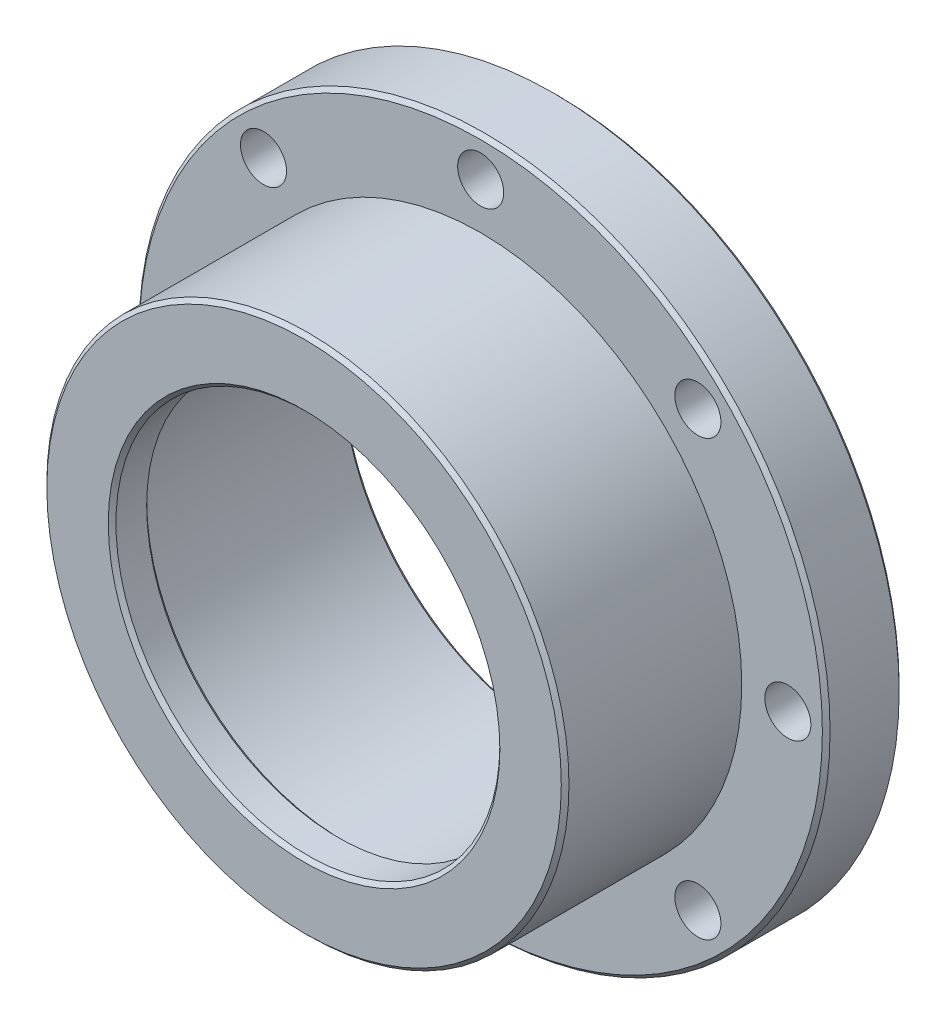
ISO-10303-21;
HEADER;
FILE_DESCRIPTION(('STEP AP214'),'2;1');
FILE_NAME('part.step','',(''),(''),'','','');
FILE_SCHEMA(('AUTOMOTIVE_DESIGN { 1 0 10303 214 1 1 1 1 }'));
ENDSEC;
DATA;
#1=APPLICATION_CONTEXT('core data for automotive mechanical design processes');
#2=APPLICATION_PROTOCOL_DEFINITION('international standard','automotive_design',2000,#1);
#3=PRODUCT_CONTEXT('',#1,'mechanical');
#4=PRODUCT('Part','Part','',(#3));
#5=PRODUCT_RELATED_PRODUCT_CATEGORY('part','',(#4));
#6=PRODUCT_DEFINITION_FORMATION('','',#4);
#7=PRODUCT_DEFINITION_CONTEXT('part definition',#1,'design');
#8=PRODUCT_DEFINITION('design','',#6,#7);
#9=PRODUCT_DEFINITION_SHAPE('','',#8);
#10=(LENGTH_UNIT() NAMED_UNIT(*) SI_UNIT(.MILLI.,.METRE.));
#11=(NAMED_UNIT(*) PLANE_ANGLE_UNIT() SI_UNIT($,.RADIAN.));
#12=(NAMED_UNIT(*) SI_UNIT($,.STERADIAN.) SOLID_ANGLE_UNIT());
#13=UNCERTAINTY_MEASURE_WITH_UNIT(LENGTH_MEASURE(1.E-05),#10,'distance_accuracy_value','');
#14=(GEOMETRIC_REPRESENTATION_CONTEXT(3) GLOBAL_UNCERTAINTY_ASSIGNED_CONTEXT((#13)) GLOBAL_UNIT_ASSIGNED_CONTEXT((#10,
#11,#12)) REPRESENTATION_CONTEXT('',''));
#15=CARTESIAN_POINT('',(0.,0.,0.));
#16=DIRECTION('',(0.,0.,1.));
#17=DIRECTION('',(1.,0.,0.));
#18=AXIS2_PLACEMENT_3D('',#15,#16,#17);
#19=CARTESIAN_POINT('',(0.,0.,-37.));
#20=DIRECTION('',(0.,0.,1.));
#21=DIRECTION('',(1.,0.,0.));
#22=AXIS2_PLACEMENT_3D('',#19,#20,#21);
#23=CYLINDRICAL_SURFACE('',#22,25.);
#24=CARTESIAN_POINT('',(0.,0.,28.5));
#25=DIRECTION('',(0.,0.,-1.));
#26=DIRECTION('',(-1.,0.,0.));
#27=AXIS2_PLACEMENT_3D('',#24,#25,#26);
#28=CIRCLE('',#27,25.);
#29=CARTESIAN_POINT('',(-25.,0.,28.5));
#30=VERTEX_POINT('',#29);
#31=EDGE_CURVE('E65',#30,#30,#28,.T.);
#32=ORIENTED_EDGE('',*,*,#31,.T.);
#33=EDGE_LOOP('',(#32));
#34=FACE_BOUND('',#33,.T.);
#35=CARTESIAN_POINT('',(0.,0.,32.5));
#36=DIRECTION('',(0.,0.,1.));
#37=DIRECTION('',(1.,0.,0.));
#38=AXIS2_PLACEMENT_3D('',#35,#36,#37);
#39=CIRCLE('',#38,25.);
#40=CARTESIAN_POINT('',(25.,0.,32.5));
#41=VERTEX_POINT('',#40);
#42=EDGE_CURVE('E68',#41,#41,#39,.T.);
#43=ORIENTED_EDGE('',*,*,#42,.T.);
#44=EDGE_LOOP('',(#43));
#45=FACE_BOUND('',#44,.T.);
#46=ADVANCED_FACE('F30',(#34,#45),#23,.F.);
#47=CARTESIAN_POINT('',(0.,0.,10.));
#48=DIRECTION('',(0.,0.,1.));
#49=DIRECTION('',(1.,0.,0.));
#50=AXIS2_PLACEMENT_3D('',#47,#48,#49);
#51=PLANE('',#50);
#52=CARTESIAN_POINT('',(0.,0.,10.));
#53=DIRECTION('',(0.,0.,1.));
#54=DIRECTION('',(1.,0.,0.));
#55=AXIS2_PLACEMENT_3D('',#52,#53,#54);
#56=CIRCLE('',#55,44.5);
#57=CARTESIAN_POINT('',(44.5,0.,10.));
#58=VERTEX_POINT('',#57);
#59=EDGE_CURVE('E45',#58,#58,#56,.T.);
#60=ORIENTED_EDGE('',*,*,#59,.T.);
#61=EDGE_LOOP('',(#60));
#62=FACE_BOUND('',#61,.T.);
#63=CARTESIAN_POINT('',(-28.2842712474619,28.2842712474619,10.));
#64=DIRECTION('',(0.,0.,1.));
#65=DIRECTION('',(1.,0.,0.));
#66=AXIS2_PLACEMENT_3D('',#63,#64,#65);
#67=CIRCLE('',#66,3.);
#68=CARTESIAN_POINT('',(-25.2842712474619,28.2842712474619,10.));
#69=VERTEX_POINT('',#68);
#70=EDGE_CURVE('E79',#69,#69,#67,.T.);
#71=ORIENTED_EDGE('',*,*,#70,.F.);
#72=EDGE_LOOP('',(#71));
#73=FACE_BOUND('',#72,.T.);
#74=CARTESIAN_POINT('',(-40.,0.,10.));
#75=DIRECTION('',(0.,0.,1.));
#76=DIRECTION('',(1.,0.,0.));
#77=AXIS2_PLACEMENT_3D('',#74,#75,#76);
#78=CIRCLE('',#77,3.);
#79=CARTESIAN_POINT('',(-37.,0.,10.));
#80=VERTEX_POINT('',#79);
#81=EDGE_CURVE('E78',#80,#80,#78,.T.);
#82=ORIENTED_EDGE('',*,*,#81,.F.);
#83=EDGE_LOOP('',(#82));
#84=FACE_BOUND('',#83,.T.);
#85=CARTESIAN_POINT('',(-28.2842712474619,-28.2842712474619,10.));
#86=DIRECTION('',(0.,0.,1.));
#87=DIRECTION('',(1.,0.,0.));
#88=AXIS2_PLACEMENT_3D('',#85,#86,#87);
#89=CIRCLE('',#88,3.);
#90=CARTESIAN_POINT('',(-25.2842712474619,-28.2842712474619,10.));
#91=VERTEX_POINT('',#90);
#92=EDGE_CURVE('E83',#91,#91,#89,.T.);
#93=ORIENTED_EDGE('',*,*,#92,.F.);
#94=EDGE_LOOP('',(#93));
#95=FACE_BOUND('',#94,.T.);
#96=CARTESIAN_POINT('',(0.,40.,10.));
#97=DIRECTION('',(0.,0.,1.));
#98=DIRECTION('',(1.,0.,0.));
#99=AXIS2_PLACEMENT_3D('',#96,#97,#98);
#100=CIRCLE('',#99,3.);
#101=CARTESIAN_POINT('',(3.,40.,10.));
#102=VERTEX_POINT('',#101);
#103=EDGE_CURVE('E87',#102,#102,#100,.T.);
#104=ORIENTED_EDGE('',*,*,#103,.F.);
#105=EDGE_LOOP('',(#104));
#106=FACE_BOUND('',#105,.T.);
#107=CARTESIAN_POINT('',(0.,-40.,10.));
#108=DIRECTION('',(0.,0.,1.));
#109=DIRECTION('',(1.,0.,0.));
#110=AXIS2_PLACEMENT_3D('',#107,#108,#109);
#111=CIRCLE('',#110,3.);
#112=CARTESIAN_POINT('',(3.00000000000001,-40.,10.));
#113=VERTEX_POINT('',#112);
#114=EDGE_CURVE('E91',#113,#113,#111,.T.);
#115=ORIENTED_EDGE('',*,*,#114,.F.);
#116=EDGE_LOOP('',(#115));
#117=FACE_BOUND('',#116,.T.);
#118=CARTESIAN_POINT('',(28.2842712474619,-28.2842712474619,10.));
#119=DIRECTION('',(0.,0.,1.));
#120=DIRECTION('',(1.,0.,0.));
#121=AXIS2_PLACEMENT_3D('',#118,#119,#120);
#122=CIRCLE('',#121,3.);
#123=CARTESIAN_POINT('',(31.2842712474619,-28.2842712474619,10.));
#124=VERTEX_POINT('',#123);
#125=EDGE_CURVE('E95',#124,#124,#122,.T.);
#126=ORIENTED_EDGE('',*,*,#125,.F.);
#127=EDGE_LOOP('',(#126));
#128=FACE_BOUND('',#127,.T.);
#129=CARTESIAN_POINT('',(40.,0.,10.));
#130=DIRECTION('',(0.,0.,1.));
#131=DIRECTION('',(1.,0.,0.));
#132=AXIS2_PLACEMENT_3D('',#129,#130,#131);
#133=CIRCLE('',#132,3.);
#134=CARTESIAN_POINT('',(43.,0.,10.));
#135=VERTEX_POINT('',#134);
#136=EDGE_CURVE('E99',#135,#135,#133,.T.);
#137=ORIENTED_EDGE('',*,*,#136,.F.);
#138=EDGE_LOOP('',(#137));
#139=FACE_BOUND('',#138,.T.);
#140=CARTESIAN_POINT('',(28.2842712474619,28.2842712474619,10.));
#141=DIRECTION('',(0.,0.,1.));
#142=DIRECTION('',(1.,0.,0.));
#143=AXIS2_PLACEMENT_3D('',#140,#141,#142);
#144=CIRCLE('',#143,3.);
#145=CARTESIAN_POINT('',(31.2842712474619,28.2842712474619,10.));
#146=VERTEX_POINT('',#145);
#147=EDGE_CURVE('E103',#146,#146,#144,.T.);
#148=ORIENTED_EDGE('',*,*,#147,.F.);
#149=EDGE_LOOP('',(#148));
#150=FACE_BOUND('',#149,.T.);
#151=CARTESIAN_POINT('',(0.,0.,10.));
#152=DIRECTION('',(0.,0.,1.));
#153=DIRECTION('',(1.,0.,0.));
#154=AXIS2_PLACEMENT_3D('',#151,#152,#153);
#155=CIRCLE('',#154,34.);
#156=CARTESIAN_POINT('',(34.,0.,10.));
#157=VERTEX_POINT('',#156);
#158=EDGE_CURVE('E74',#157,#157,#155,.T.);
#159=ORIENTED_EDGE('',*,*,#158,.F.);
#160=EDGE_LOOP('',(#159));
#161=FACE_BOUND('',#160,.T.);
#162=ADVANCED_FACE('F132',(#62,#73,#84,#95,#106,#117,#128,#139,#150,#161),#51,.T.);
#163=CARTESIAN_POINT('',(0.,0.,10.));
#164=DIRECTION('',(0.,0.,-1.));
#165=DIRECTION('',(-1.,0.,0.));
#166=AXIS2_PLACEMENT_3D('',#163,#164,#165);
#167=CYLINDRICAL_SURFACE('',#166,45.);
#168=CARTESIAN_POINT('',(0.,0.,0.499999999999987));
#169=DIRECTION('',(0.,0.,1.));
#170=DIRECTION('',(1.,0.,0.));
#171=AXIS2_PLACEMENT_3D('',#168,#169,#170);
#172=CIRCLE('',#171,45.);
#173=CARTESIAN_POINT('',(45.,0.,0.499999999999987));
#174=VERTEX_POINT('',#173);
#175=EDGE_CURVE('E50',#174,#174,#172,.T.);
#176=ORIENTED_EDGE('',*,*,#175,.T.);
#177=EDGE_LOOP('',(#176));
#178=FACE_BOUND('',#177,.T.);
#179=CARTESIAN_POINT('',(0.,0.,9.49999999999999));
#180=DIRECTION('',(0.,0.,1.));
#181=DIRECTION('',(1.,0.,0.));
#182=AXIS2_PLACEMENT_3D('',#179,#180,#181);
#183=CIRCLE('',#182,45.);
#184=CARTESIAN_POINT('',(45.,0.,9.49999999999999));
#185=VERTEX_POINT('',#184);
#186=EDGE_CURVE('E53',#185,#185,#183,.F.);
#187=ORIENTED_EDGE('',*,*,#186,.T.);
#188=EDGE_LOOP('',(#187));
#189=FACE_BOUND('',#188,.T.);
#190=ADVANCED_FACE('F135',(#178,#189),#167,.T.);
#191=CARTESIAN_POINT('',(0.,0.,0.));
#192=DIRECTION('',(0.,0.,1.));
#193=DIRECTION('',(1.,0.,0.));
#194=AXIS2_PLACEMENT_3D('',#191,#192,#193);
#195=PLANE('',#194);
#196=CARTESIAN_POINT('',(0.,0.,0.));
#197=DIRECTION('',(0.,0.,1.));
#198=DIRECTION('',(1.,0.,0.));
#199=AXIS2_PLACEMENT_3D('',#196,#197,#198);
#200=CIRCLE('',#199,28.);
#201=CARTESIAN_POINT('',(28.,0.,0.));
#202=VERTEX_POINT('',#201);
#203=EDGE_CURVE('E56',#202,#202,#200,.T.);
#204=ORIENTED_EDGE('',*,*,#203,.T.);
#205=EDGE_LOOP('',(#204));
#206=FACE_BOUND('',#205,.T.);
#207=CARTESIAN_POINT('',(0.,0.,0.));
#208=DIRECTION('',(0.,0.,1.));
#209=DIRECTION('',(1.,0.,0.));
#210=AXIS2_PLACEMENT_3D('',#207,#208,#209);
#211=CIRCLE('',#210,44.5);
#212=CARTESIAN_POINT('',(44.5,0.,0.));
#213=VERTEX_POINT('',#212);
#214=EDGE_CURVE('E59',#213,#213,#211,.F.);
#215=ORIENTED_EDGE('',*,*,#214,.T.);
#216=EDGE_LOOP('',(#215));
#217=FACE_BOUND('',#216,.T.);
#218=CARTESIAN_POINT('',(-28.2842712474619,28.2842712474619,0.));
#219=DIRECTION('',(0.,0.,1.));
#220=DIRECTION('',(1.,0.,0.));
#221=AXIS2_PLACEMENT_3D('',#218,#219,#220);
#222=CIRCLE('',#221,3.);
#223=CARTESIAN_POINT('',(-25.2842712474619,28.2842712474619,0.));
#224=VERTEX_POINT('',#223);
#225=EDGE_CURVE('E75',#224,#224,#222,.T.);
#226=ORIENTED_EDGE('',*,*,#225,.T.);
#227=EDGE_LOOP('',(#226));
#228=FACE_BOUND('',#227,.T.);
#229=CARTESIAN_POINT('',(-40.,0.,0.));
#230=DIRECTION('',(0.,0.,1.));
#231=DIRECTION('',(1.,0.,0.));
#232=AXIS2_PLACEMENT_3D('',#229,#230,#231);
#233=CIRCLE('',#232,3.);
#234=CARTESIAN_POINT('',(-37.,0.,0.));
#235=VERTEX_POINT('',#234);
#236=EDGE_CURVE('E80',#235,#235,#233,.T.);
#237=ORIENTED_EDGE('',*,*,#236,.T.);
#238=EDGE_LOOP('',(#237));
#239=FACE_BOUND('',#238,.T.);
#240=CARTESIAN_POINT('',(-28.2842712474619,-28.2842712474619,0.));
#241=DIRECTION('',(0.,0.,1.));
#242=DIRECTION('',(1.,0.,0.));
#243=AXIS2_PLACEMENT_3D('',#240,#241,#242);
#244=CIRCLE('',#243,3.);
#245=CARTESIAN_POINT('',(-25.2842712474619,-28.2842712474619,0.));
#246=VERTEX_POINT('',#245);
#247=EDGE_CURVE('E84',#246,#246,#244,.T.);
#248=ORIENTED_EDGE('',*,*,#247,.T.);
#249=EDGE_LOOP('',(#248));
#250=FACE_BOUND('',#249,.T.);
#251=CARTESIAN_POINT('',(0.,40.,0.));
#252=DIRECTION('',(0.,0.,1.));
#253=DIRECTION('',(1.,0.,0.));
#254=AXIS2_PLACEMENT_3D('',#251,#252,#253);
#255=CIRCLE('',#254,3.);
#256=CARTESIAN_POINT('',(3.,40.,0.));
#257=VERTEX_POINT('',#256);
#258=EDGE_CURVE('E88',#257,#257,#255,.T.);
#259=ORIENTED_EDGE('',*,*,#258,.T.);
#260=EDGE_LOOP('',(#259));
#261=FACE_BOUND('',#260,.T.);
#262=CARTESIAN_POINT('',(0.,-40.,0.));
#263=DIRECTION('',(0.,0.,1.));
#264=DIRECTION('',(1.,0.,0.));
#265=AXIS2_PLACEMENT_3D('',#262,#263,#264);
#266=CIRCLE('',#265,3.);
#267=CARTESIAN_POINT('',(3.00000000000001,-40.,0.));
#268=VERTEX_POINT('',#267);
#269=EDGE_CURVE('E92',#268,#268,#266,.T.);
#270=ORIENTED_EDGE('',*,*,#269,.T.);
#271=EDGE_LOOP('',(#270));
#272=FACE_BOUND('',#271,.T.);
#273=CARTESIAN_POINT('',(28.2842712474619,-28.2842712474619,0.));
#274=DIRECTION('',(0.,0.,1.));
#275=DIRECTION('',(1.,0.,0.));
#276=AXIS2_PLACEMENT_3D('',#273,#274,#275);
#277=CIRCLE('',#276,3.);
#278=CARTESIAN_POINT('',(31.2842712474619,-28.2842712474619,0.));
#279=VERTEX_POINT('',#278);
#280=EDGE_CURVE('E96',#279,#279,#277,.T.);
#281=ORIENTED_EDGE('',*,*,#280,.T.);
#282=EDGE_LOOP('',(#281));
#283=FACE_BOUND('',#282,.T.);
#284=CARTESIAN_POINT('',(40.,0.,0.));
#285=DIRECTION('',(0.,0.,1.));
#286=DIRECTION('',(1.,0.,0.));
#287=AXIS2_PLACEMENT_3D('',#284,#285,#286);
#288=CIRCLE('',#287,3.);
#289=CARTESIAN_POINT('',(43.,0.,0.));
#290=VERTEX_POINT('',#289);
#291=EDGE_CURVE('E100',#290,#290,#288,.T.);
#292=ORIENTED_EDGE('',*,*,#291,.T.);
#293=EDGE_LOOP('',(#292));
#294=FACE_BOUND('',#293,.T.);
#295=CARTESIAN_POINT('',(28.2842712474619,28.2842712474619,0.));
#296=DIRECTION('',(0.,0.,1.));
#297=DIRECTION('',(1.,0.,0.));
#298=AXIS2_PLACEMENT_3D('',#295,#296,#297);
#299=CIRCLE('',#298,3.);
#300=CARTESIAN_POINT('',(31.2842712474619,28.2842712474619,0.));
#301=VERTEX_POINT('',#300);
#302=EDGE_CURVE('E104',#301,#301,#299,.T.);
#303=ORIENTED_EDGE('',*,*,#302,.T.);
#304=EDGE_LOOP('',(#303));
#305=FACE_BOUND('',#304,.T.);
#306=ADVANCED_FACE('F157',(#206,#217,#228,#239,#250,#261,#272,#283,#294,#305),#195,.F.);
#307=CARTESIAN_POINT('',(0.,0.,33.));
#308=DIRECTION('',(0.,0.,-1.));
#309=DIRECTION('',(-1.,0.,0.));
#310=AXIS2_PLACEMENT_3D('',#307,#308,#309);
#311=CYLINDRICAL_SURFACE('',#310,34.);
#312=CARTESIAN_POINT('',(0.,0.,32.5));
#313=DIRECTION('',(0.,0.,1.));
#314=DIRECTION('',(1.,0.,0.));
#315=AXIS2_PLACEMENT_3D('',#312,#313,#314);
#316=CIRCLE('',#315,34.);
#317=CARTESIAN_POINT('',(34.,0.,32.5));
#318=VERTEX_POINT('',#317);
#319=EDGE_CURVE('E10',#318,#318,#316,.F.);
#320=ORIENTED_EDGE('',*,*,#319,.T.);
#321=EDGE_LOOP('',(#320));
#322=FACE_BOUND('',#321,.T.);
#323=ORIENTED_EDGE('',*,*,#158,.T.);
#324=EDGE_LOOP('',(#323));
#325=FACE_BOUND('',#324,.T.);
#326=ADVANCED_FACE('F154',(#322,#325),#311,.T.);
#327=CARTESIAN_POINT('',(0.,0.,33.));
#328=DIRECTION('',(0.,0.,1.));
#329=DIRECTION('',(1.,0.,0.));
#330=AXIS2_PLACEMENT_3D('',#327,#328,#329);
#331=PLANE('',#330);
#332=CARTESIAN_POINT('',(0.,0.,33.));
#333=DIRECTION('',(0.,0.,1.));
#334=DIRECTION('',(1.,0.,0.));
#335=AXIS2_PLACEMENT_3D('',#332,#333,#334);
#336=CIRCLE('',#335,25.5);
#337=CARTESIAN_POINT('',(25.5,0.,33.));
#338=VERTEX_POINT('',#337);
#339=EDGE_CURVE('E37',#338,#338,#336,.F.);
#340=ORIENTED_EDGE('',*,*,#339,.T.);
#341=EDGE_LOOP('',(#340));
#342=FACE_BOUND('',#341,.T.);
#343=CARTESIAN_POINT('',(0.,0.,33.));
#344=DIRECTION('',(0.,0.,1.));
#345=DIRECTION('',(1.,0.,0.));
#346=AXIS2_PLACEMENT_3D('',#343,#344,#345);
#347=CIRCLE('',#346,33.5);
#348=CARTESIAN_POINT('',(33.5,0.,33.));
#349=VERTEX_POINT('',#348);
#350=EDGE_CURVE('E41',#349,#349,#347,.T.);
#351=ORIENTED_EDGE('',*,*,#350,.T.);
#352=EDGE_LOOP('',(#351));
#353=FACE_BOUND('',#352,.T.);
#354=ADVANCED_FACE('F156',(#342,#353),#331,.T.);
#355=CARTESIAN_POINT('',(0.,0.,28.));
#356=DIRECTION('',(0.,0.,-1.));
#357=DIRECTION('',(-1.,0.,0.));
#358=AXIS2_PLACEMENT_3D('',#355,#356,#357);
#359=PLANE('',#358);
#360=CARTESIAN_POINT('',(0.,0.,28.));
#361=DIRECTION('',(0.,0.,-1.));
#362=DIRECTION('',(-1.,0.,0.));
#363=AXIS2_PLACEMENT_3D('',#360,#361,#362);
#364=CIRCLE('',#363,25.5);
#365=CARTESIAN_POINT('',(-25.5,0.,28.));
#366=VERTEX_POINT('',#365);
#367=EDGE_CURVE('E71',#366,#366,#364,.F.);
#368=ORIENTED_EDGE('',*,*,#367,.T.);
#369=EDGE_LOOP('',(#368));
#370=FACE_BOUND('',#369,.T.);
#371=CARTESIAN_POINT('',(0.,0.,28.));
#372=DIRECTION('',(0.,0.,-1.));
#373=DIRECTION('',(-1.,0.,0.));
#374=AXIS2_PLACEMENT_3D('',#371,#372,#373);
#375=CIRCLE('',#374,27.5);
#376=CARTESIAN_POINT('',(-27.5,0.,28.));
#377=VERTEX_POINT('',#376);
#378=EDGE_CURVE('E107',#377,#377,#375,.T.);
#379=ORIENTED_EDGE('',*,*,#378,.T.);
#380=EDGE_LOOP('',(#379));
#381=FACE_BOUND('',#380,.T.);
#382=ADVANCED_FACE('F163',(#370,#381),#359,.T.);
#383=CARTESIAN_POINT('',(0.,0.,28.));
#384=DIRECTION('',(0.,0.,-1.));
#385=DIRECTION('',(-1.,0.,0.));
#386=AXIS2_PLACEMENT_3D('',#383,#384,#385);
#387=CYLINDRICAL_SURFACE('',#386,27.5);
#388=CARTESIAN_POINT('',(0.,0.,0.49999999999999));
#389=DIRECTION('',(0.,0.,1.));
#390=DIRECTION('',(1.,0.,0.));
#391=AXIS2_PLACEMENT_3D('',#388,#389,#390);
#392=CIRCLE('',#391,27.5);
#393=CARTESIAN_POINT('',(27.5,0.,0.49999999999999));
#394=VERTEX_POINT('',#393);
#395=EDGE_CURVE('E62',#394,#394,#392,.F.);
#396=ORIENTED_EDGE('',*,*,#395,.T.);
#397=EDGE_LOOP('',(#396));
#398=FACE_BOUND('',#397,.T.);
#399=ORIENTED_EDGE('',*,*,#378,.F.);
#400=EDGE_LOOP('',(#399));
#401=FACE_BOUND('',#400,.T.);
#402=ADVANCED_FACE('F174',(#398,#401),#387,.F.);
#403=CARTESIAN_POINT('',(28.2842712474619,28.2842712474619,-15.));
#404=DIRECTION('',(0.,0.,1.));
#405=DIRECTION('',(1.,0.,0.));
#406=AXIS2_PLACEMENT_3D('',#403,#404,#405);
#407=CYLINDRICAL_SURFACE('',#406,3.);
#408=ORIENTED_EDGE('',*,*,#147,.T.);
#409=EDGE_LOOP('',(#408));
#410=FACE_BOUND('',#409,.T.);
#411=ORIENTED_EDGE('',*,*,#302,.F.);
#412=EDGE_LOOP('',(#411));
#413=FACE_BOUND('',#412,.T.);
#414=ADVANCED_FACE('F177',(#410,#413),#407,.F.);
#415=CARTESIAN_POINT('',(40.,0.,-15.));
#416=DIRECTION('',(0.,0.,1.));
#417=DIRECTION('',(1.,0.,0.));
#418=AXIS2_PLACEMENT_3D('',#415,#416,#417);
#419=CYLINDRICAL_SURFACE('',#418,3.);
#420=ORIENTED_EDGE('',*,*,#136,.T.);
#421=EDGE_LOOP('',(#420));
#422=FACE_BOUND('',#421,.T.);
#423=ORIENTED_EDGE('',*,*,#291,.F.);
#424=EDGE_LOOP('',(#423));
#425=FACE_BOUND('',#424,.T.);
#426=ADVANCED_FACE('F184',(#422,#425),#419,.F.);
#427=CARTESIAN_POINT('',(28.2842712474619,-28.2842712474619,-15.));
#428=DIRECTION('',(0.,0.,1.));
#429=DIRECTION('',(1.,0.,0.));
#430=AXIS2_PLACEMENT_3D('',#427,#428,#429);
#431=CYLINDRICAL_SURFACE('',#430,3.);
#432=ORIENTED_EDGE('',*,*,#125,.T.);
#433=EDGE_LOOP('',(#432));
#434=FACE_BOUND('',#433,.T.);
#435=ORIENTED_EDGE('',*,*,#280,.F.);
#436=EDGE_LOOP('',(#435));
#437=FACE_BOUND('',#436,.T.);
#438=ADVANCED_FACE('F188',(#434,#437),#431,.F.);
#439=CARTESIAN_POINT('',(0.,-40.,-15.));
#440=DIRECTION('',(0.,0.,1.));
#441=DIRECTION('',(1.,0.,0.));
#442=AXIS2_PLACEMENT_3D('',#439,#440,#441);
#443=CYLINDRICAL_SURFACE('',#442,3.);
#444=ORIENTED_EDGE('',*,*,#114,.T.);
#445=EDGE_LOOP('',(#444));
#446=FACE_BOUND('',#445,.T.);
#447=ORIENTED_EDGE('',*,*,#269,.F.);
#448=EDGE_LOOP('',(#447));
#449=FACE_BOUND('',#448,.T.);
#450=ADVANCED_FACE('F192',(#446,#449),#443,.F.);
#451=CARTESIAN_POINT('',(0.,40.,-15.));
#452=DIRECTION('',(0.,0.,1.));
#453=DIRECTION('',(1.,0.,0.));
#454=AXIS2_PLACEMENT_3D('',#451,#452,#453);
#455=CYLINDRICAL_SURFACE('',#454,3.);
#456=ORIENTED_EDGE('',*,*,#103,.T.);
#457=EDGE_LOOP('',(#456));
#458=FACE_BOUND('',#457,.T.);
#459=ORIENTED_EDGE('',*,*,#258,.F.);
#460=EDGE_LOOP('',(#459));
#461=FACE_BOUND('',#460,.T.);
#462=ADVANCED_FACE('F196',(#458,#461),#455,.F.);
#463=CARTESIAN_POINT('',(-28.2842712474619,-28.2842712474619,-15.));
#464=DIRECTION('',(0.,0.,1.));
#465=DIRECTION('',(1.,0.,0.));
#466=AXIS2_PLACEMENT_3D('',#463,#464,#465);
#467=CYLINDRICAL_SURFACE('',#466,3.);
#468=ORIENTED_EDGE('',*,*,#92,.T.);
#469=EDGE_LOOP('',(#468));
#470=FACE_BOUND('',#469,.T.);
#471=ORIENTED_EDGE('',*,*,#247,.F.);
#472=EDGE_LOOP('',(#471));
#473=FACE_BOUND('',#472,.T.);
#474=ADVANCED_FACE('F200',(#470,#473),#467,.F.);
#475=CARTESIAN_POINT('',(-40.,0.,-15.));
#476=DIRECTION('',(0.,0.,1.));
#477=DIRECTION('',(1.,0.,0.));
#478=AXIS2_PLACEMENT_3D('',#475,#476,#477);
#479=CYLINDRICAL_SURFACE('',#478,3.);
#480=ORIENTED_EDGE('',*,*,#81,.T.);
#481=EDGE_LOOP('',(#480));
#482=FACE_BOUND('',#481,.T.);
#483=ORIENTED_EDGE('',*,*,#236,.F.);
#484=EDGE_LOOP('',(#483));
#485=FACE_BOUND('',#484,.T.);
#486=ADVANCED_FACE('F204',(#482,#485),#479,.F.);
#487=CARTESIAN_POINT('',(-28.2842712474619,28.2842712474619,-15.));
#488=DIRECTION('',(0.,0.,1.));
#489=DIRECTION('',(1.,0.,0.));
#490=AXIS2_PLACEMENT_3D('',#487,#488,#489);
#491=CYLINDRICAL_SURFACE('',#490,3.);
#492=ORIENTED_EDGE('',*,*,#70,.T.);
#493=EDGE_LOOP('',(#492));
#494=FACE_BOUND('',#493,.T.);
#495=ORIENTED_EDGE('',*,*,#225,.F.);
#496=EDGE_LOOP('',(#495));
#497=FACE_BOUND('',#496,.T.);
#498=ADVANCED_FACE('F129',(#494,#497),#491,.F.);
#499=CARTESIAN_POINT('',(0.,0.,28.));
#500=DIRECTION('',(0.,0.,-1.));
#501=DIRECTION('',(-1.,0.,0.));
#502=AXIS2_PLACEMENT_3D('',#499,#500,#501);
#503=CONICAL_SURFACE('',#502,25.5,0.785398163397431);
#504=ORIENTED_EDGE('',*,*,#31,.F.);
#505=EDGE_LOOP('',(#504));
#506=FACE_BOUND('',#505,.T.);
#507=ORIENTED_EDGE('',*,*,#367,.F.);
#508=EDGE_LOOP('',(#507));
#509=FACE_BOUND('',#508,.T.);
#510=ADVANCED_FACE('F210',(#506,#509),#503,.F.);
#511=CARTESIAN_POINT('',(0.,0.,0.49999999999999));
#512=DIRECTION('',(0.,0.,-1.));
#513=DIRECTION('',(-1.,0.,0.));
#514=AXIS2_PLACEMENT_3D('',#511,#512,#513);
#515=CONICAL_SURFACE('',#514,27.5,0.785398163397455);
#516=ORIENTED_EDGE('',*,*,#203,.F.);
#517=EDGE_LOOP('',(#516));
#518=FACE_BOUND('',#517,.T.);
#519=ORIENTED_EDGE('',*,*,#395,.F.);
#520=EDGE_LOOP('',(#519));
#521=FACE_BOUND('',#520,.T.);
#522=ADVANCED_FACE('F214',(#518,#521),#515,.F.);
#523=CARTESIAN_POINT('',(0.,0.,0.499999999999987));
#524=DIRECTION('',(0.,0.,1.));
#525=DIRECTION('',(1.,0.,0.));
#526=AXIS2_PLACEMENT_3D('',#523,#524,#525);
#527=CONICAL_SURFACE('',#526,45.,0.785398163397462);
#528=ORIENTED_EDGE('',*,*,#214,.F.);
#529=EDGE_LOOP('',(#528));
#530=FACE_BOUND('',#529,.T.);
#531=ORIENTED_EDGE('',*,*,#175,.F.);
#532=EDGE_LOOP('',(#531));
#533=FACE_BOUND('',#532,.T.);
#534=ADVANCED_FACE('F220',(#530,#533),#527,.T.);
#535=CARTESIAN_POINT('',(0.,0.,10.));
#536=DIRECTION('',(0.,0.,-1.));
#537=DIRECTION('',(-1.,0.,0.));
#538=AXIS2_PLACEMENT_3D('',#535,#536,#537);
#539=CONICAL_SURFACE('',#538,44.5,0.785398163397455);
#540=ORIENTED_EDGE('',*,*,#186,.F.);
#541=EDGE_LOOP('',(#540));
#542=FACE_BOUND('',#541,.T.);
#543=ORIENTED_EDGE('',*,*,#59,.F.);
#544=EDGE_LOOP('',(#543));
#545=FACE_BOUND('',#544,.T.);
#546=ADVANCED_FACE('F229',(#542,#545),#539,.T.);
#547=CARTESIAN_POINT('',(0.,0.,32.5));
#548=DIRECTION('',(0.,0.,1.));
#549=DIRECTION('',(1.,0.,0.));
#550=AXIS2_PLACEMENT_3D('',#547,#548,#549);
#551=CONICAL_SURFACE('',#550,25.,0.785398163397438);
#552=ORIENTED_EDGE('',*,*,#339,.F.);
#553=EDGE_LOOP('',(#552));
#554=FACE_BOUND('',#553,.T.);
#555=ORIENTED_EDGE('',*,*,#42,.F.);
#556=EDGE_LOOP('',(#555));
#557=FACE_BOUND('',#556,.T.);
#558=ADVANCED_FACE('F232',(#554,#557),#551,.F.);
#559=CARTESIAN_POINT('',(0.,0.,33.));
#560=DIRECTION('',(0.,0.,-1.));
#561=DIRECTION('',(-1.,0.,0.));
#562=AXIS2_PLACEMENT_3D('',#559,#560,#561);
#563=CONICAL_SURFACE('',#562,33.5,0.785398163397428);
#564=ORIENTED_EDGE('',*,*,#319,.F.);
#565=EDGE_LOOP('',(#564));
#566=FACE_BOUND('',#565,.T.);
#567=ORIENTED_EDGE('',*,*,#350,.F.);
#568=EDGE_LOOP('',(#567));
#569=FACE_BOUND('',#568,.T.);
#570=ADVANCED_FACE('F32',(#566,#569),#563,.T.);
#571=CLOSED_SHELL('',(#46,#162,#190,#306,#326,#354,#382,#402,#414,#426,#438,#450,#462,#474,#486,
#498,#510,#522,#534,#546,#558,#570));
#572=MANIFOLD_SOLID_BREP('B2',#571);
#573=ADVANCED_BREP_SHAPE_REPRESENTATION('',(#18,#572),#14);
#574=SHAPE_DEFINITION_REPRESENTATION(#9,#573);
ENDSEC;
END-ISO-10303-21;
